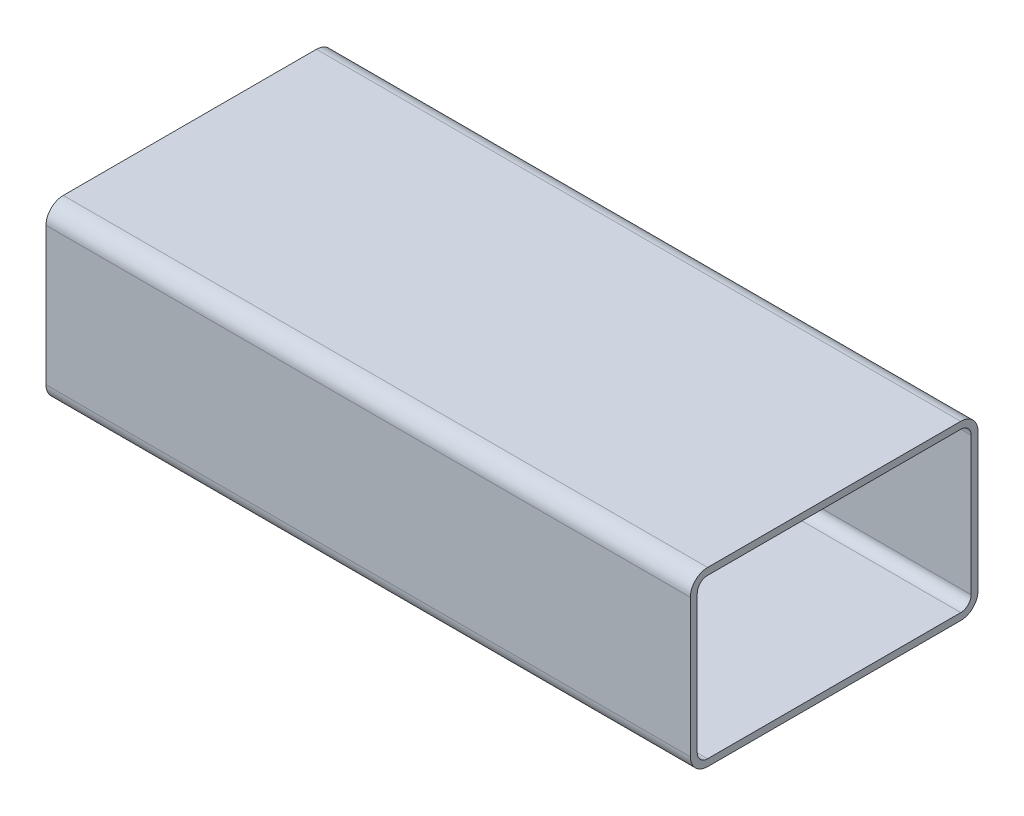
ISO-10303-21;
HEADER;
FILE_DESCRIPTION(('STEP AP214'),'2;1');
FILE_NAME('part.step','',(''),(''),'','','');
FILE_SCHEMA(('AUTOMOTIVE_DESIGN { 1 0 10303 214 1 1 1 1 }'));
ENDSEC;
DATA;
#1=APPLICATION_CONTEXT('core data for automotive mechanical design processes');
#2=APPLICATION_PROTOCOL_DEFINITION('international standard','automotive_design',2000,#1);
#3=PRODUCT_CONTEXT('',#1,'mechanical');
#4=PRODUCT('Part','Part','',(#3));
#5=PRODUCT_RELATED_PRODUCT_CATEGORY('part','',(#4));
#6=PRODUCT_DEFINITION_FORMATION('','',#4);
#7=PRODUCT_DEFINITION_CONTEXT('part definition',#1,'design');
#8=PRODUCT_DEFINITION('design','',#6,#7);
#9=PRODUCT_DEFINITION_SHAPE('','',#8);
#10=(LENGTH_UNIT() NAMED_UNIT(*) SI_UNIT(.MILLI.,.METRE.));
#11=(NAMED_UNIT(*) PLANE_ANGLE_UNIT() SI_UNIT($,.RADIAN.));
#12=(NAMED_UNIT(*) SI_UNIT($,.STERADIAN.) SOLID_ANGLE_UNIT());
#13=UNCERTAINTY_MEASURE_WITH_UNIT(LENGTH_MEASURE(1.E-05),#10,'distance_accuracy_value','');
#14=(GEOMETRIC_REPRESENTATION_CONTEXT(3) GLOBAL_UNCERTAINTY_ASSIGNED_CONTEXT((#13)) GLOBAL_UNIT_ASSIGNED_CONTEXT((#10,
#11,#12)) REPRESENTATION_CONTEXT('',''));
#15=CARTESIAN_POINT('',(0.,0.,0.));
#16=DIRECTION('',(0.,0.,1.));
#17=DIRECTION('',(1.,0.,0.));
#18=AXIS2_PLACEMENT_3D('',#15,#16,#17);
#19=CARTESIAN_POINT('',(112.,12.,22.));
#20=DIRECTION('',(-1.,0.,0.));
#21=DIRECTION('',(0.,0.,1.));
#22=AXIS2_PLACEMENT_3D('',#19,#20,#21);
#23=CYLINDRICAL_SURFACE('',#22,3.);
#24=CARTESIAN_POINT('',(0.,12.,22.));
#25=DIRECTION('',(1.,0.,0.));
#26=DIRECTION('',(0.,0.,-1.));
#27=AXIS2_PLACEMENT_3D('',#24,#25,#26);
#28=CIRCLE('',#27,3.);
#29=CARTESIAN_POINT('',(0.,15.,22.));
#30=VERTEX_POINT('',#29);
#31=CARTESIAN_POINT('',(0.,12.,25.));
#32=VERTEX_POINT('',#31);
#33=EDGE_CURVE('E256',#30,#32,#28,.T.);
#34=ORIENTED_EDGE('',*,*,#33,.T.);
#35=DIRECTION('',(-1.,0.,0.));
#36=VECTOR('',#35,1.);
#37=CARTESIAN_POINT('',(112.,12.,25.));
#38=LINE('',#37,#36);
#39=CARTESIAN_POINT('',(112.,12.,25.));
#40=VERTEX_POINT('',#39);
#41=EDGE_CURVE('E12',#40,#32,#38,.T.);
#42=ORIENTED_EDGE('',*,*,#41,.F.);
#43=CARTESIAN_POINT('',(112.,12.,22.));
#44=DIRECTION('',(1.,0.,0.));
#45=DIRECTION('',(0.,0.,-1.));
#46=AXIS2_PLACEMENT_3D('',#43,#44,#45);
#47=CIRCLE('',#46,3.);
#48=CARTESIAN_POINT('',(112.,15.,22.));
#49=VERTEX_POINT('',#48);
#50=EDGE_CURVE('E365',#49,#40,#47,.T.);
#51=ORIENTED_EDGE('',*,*,#50,.F.);
#52=DIRECTION('',(-1.,0.,0.));
#53=VECTOR('',#52,1.);
#54=CARTESIAN_POINT('',(112.,15.,22.));
#55=LINE('',#54,#53);
#56=EDGE_CURVE('E279',#49,#30,#55,.T.);
#57=ORIENTED_EDGE('',*,*,#56,.T.);
#58=EDGE_LOOP('',(#34,#42,#51,#57));
#59=FACE_BOUND('',#58,.T.);
#60=ADVANCED_FACE('F70',(#59),#23,.T.);
#61=CARTESIAN_POINT('',(112.,12.,25.));
#62=DIRECTION('',(0.,0.,-1.));
#63=DIRECTION('',(-1.,0.,0.));
#64=AXIS2_PLACEMENT_3D('',#61,#62,#63);
#65=PLANE('',#64);
#66=DIRECTION('',(0.,-1.,0.));
#67=VECTOR('',#66,1.);
#68=CARTESIAN_POINT('',(0.,12.,25.));
#69=LINE('',#68,#67);
#70=CARTESIAN_POINT('',(0.,-12.,25.));
#71=VERTEX_POINT('',#70);
#72=EDGE_CURVE('E260',#32,#71,#69,.T.);
#73=ORIENTED_EDGE('',*,*,#72,.T.);
#74=DIRECTION('',(-1.,0.,0.));
#75=VECTOR('',#74,1.);
#76=CARTESIAN_POINT('',(112.,-12.,25.));
#77=LINE('',#76,#75);
#78=CARTESIAN_POINT('',(112.,-12.,25.));
#79=VERTEX_POINT('',#78);
#80=EDGE_CURVE('E81',#79,#71,#77,.T.);
#81=ORIENTED_EDGE('',*,*,#80,.F.);
#82=DIRECTION('',(0.,-1.,0.));
#83=VECTOR('',#82,1.);
#84=CARTESIAN_POINT('',(112.,12.,25.));
#85=LINE('',#84,#83);
#86=EDGE_CURVE('E368',#40,#79,#85,.T.);
#87=ORIENTED_EDGE('',*,*,#86,.F.);
#88=ORIENTED_EDGE('',*,*,#41,.T.);
#89=EDGE_LOOP('',(#73,#81,#87,#88));
#90=FACE_BOUND('',#89,.T.);
#91=ADVANCED_FACE('F461',(#90),#65,.F.);
#92=CARTESIAN_POINT('',(112.,-12.,22.));
#93=DIRECTION('',(-1.,0.,0.));
#94=DIRECTION('',(0.,0.,1.));
#95=AXIS2_PLACEMENT_3D('',#92,#93,#94);
#96=CYLINDRICAL_SURFACE('',#95,3.);
#97=CARTESIAN_POINT('',(0.,-12.,22.));
#98=DIRECTION('',(1.,0.,0.));
#99=DIRECTION('',(0.,0.,-1.));
#100=AXIS2_PLACEMENT_3D('',#97,#98,#99);
#101=CIRCLE('',#100,3.);
#102=CARTESIAN_POINT('',(0.,-15.,22.));
#103=VERTEX_POINT('',#102);
#104=EDGE_CURVE('E263',#71,#103,#101,.T.);
#105=ORIENTED_EDGE('',*,*,#104,.T.);
#106=DIRECTION('',(-1.,0.,0.));
#107=VECTOR('',#106,1.);
#108=CARTESIAN_POINT('',(112.,-15.,22.));
#109=LINE('',#108,#107);
#110=CARTESIAN_POINT('',(112.,-15.,22.));
#111=VERTEX_POINT('',#110);
#112=EDGE_CURVE('E290',#111,#103,#109,.T.);
#113=ORIENTED_EDGE('',*,*,#112,.F.);
#114=CARTESIAN_POINT('',(112.,-12.,22.));
#115=DIRECTION('',(1.,0.,0.));
#116=DIRECTION('',(0.,0.,-1.));
#117=AXIS2_PLACEMENT_3D('',#114,#115,#116);
#118=CIRCLE('',#117,3.);
#119=EDGE_CURVE('E371',#79,#111,#118,.T.);
#120=ORIENTED_EDGE('',*,*,#119,.F.);
#121=ORIENTED_EDGE('',*,*,#80,.T.);
#122=EDGE_LOOP('',(#105,#113,#120,#121));
#123=FACE_BOUND('',#122,.T.);
#124=ADVANCED_FACE('F467',(#123),#96,.T.);
#125=CARTESIAN_POINT('',(112.,-15.,-22.));
#126=DIRECTION('',(0.,1.,0.));
#127=DIRECTION('',(0.,0.,1.));
#128=AXIS2_PLACEMENT_3D('',#125,#126,#127);
#129=PLANE('',#128);
#130=DIRECTION('',(0.,0.,-1.));
#131=VECTOR('',#130,1.);
#132=CARTESIAN_POINT('',(0.,-15.,-22.));
#133=LINE('',#132,#131);
#134=CARTESIAN_POINT('',(0.,-15.,-22.));
#135=VERTEX_POINT('',#134);
#136=EDGE_CURVE('E266',#103,#135,#133,.T.);
#137=ORIENTED_EDGE('',*,*,#136,.T.);
#138=DIRECTION('',(-1.,0.,0.));
#139=VECTOR('',#138,1.);
#140=CARTESIAN_POINT('',(112.,-15.,-22.));
#141=LINE('',#140,#139);
#142=CARTESIAN_POINT('',(112.,-15.,-22.));
#143=VERTEX_POINT('',#142);
#144=EDGE_CURVE('E286',#143,#135,#141,.T.);
#145=ORIENTED_EDGE('',*,*,#144,.F.);
#146=DIRECTION('',(0.,0.,-1.));
#147=VECTOR('',#146,1.);
#148=CARTESIAN_POINT('',(112.,-15.,-22.));
#149=LINE('',#148,#147);
#150=EDGE_CURVE('E374',#111,#143,#149,.T.);
#151=ORIENTED_EDGE('',*,*,#150,.F.);
#152=ORIENTED_EDGE('',*,*,#112,.T.);
#153=EDGE_LOOP('',(#137,#145,#151,#152));
#154=FACE_BOUND('',#153,.T.);
#155=ADVANCED_FACE('F607',(#154),#129,.F.);
#156=CARTESIAN_POINT('',(112.,-12.,-22.));
#157=DIRECTION('',(-1.,0.,0.));
#158=DIRECTION('',(0.,0.,1.));
#159=AXIS2_PLACEMENT_3D('',#156,#157,#158);
#160=CYLINDRICAL_SURFACE('',#159,3.);
#161=CARTESIAN_POINT('',(0.,-12.,-22.));
#162=DIRECTION('',(1.,0.,0.));
#163=DIRECTION('',(0.,0.,-1.));
#164=AXIS2_PLACEMENT_3D('',#161,#162,#163);
#165=CIRCLE('',#164,3.);
#166=CARTESIAN_POINT('',(0.,-12.,-25.));
#167=VERTEX_POINT('',#166);
#168=EDGE_CURVE('E269',#135,#167,#165,.T.);
#169=ORIENTED_EDGE('',*,*,#168,.T.);
#170=DIRECTION('',(-1.,0.,0.));
#171=VECTOR('',#170,1.);
#172=CARTESIAN_POINT('',(112.,-12.,-25.));
#173=LINE('',#172,#171);
#174=CARTESIAN_POINT('',(112.,-12.,-25.));
#175=VERTEX_POINT('',#174);
#176=EDGE_CURVE('E212',#175,#167,#173,.T.);
#177=ORIENTED_EDGE('',*,*,#176,.F.);
#178=CARTESIAN_POINT('',(112.,-12.,-22.));
#179=DIRECTION('',(1.,0.,0.));
#180=DIRECTION('',(0.,0.,-1.));
#181=AXIS2_PLACEMENT_3D('',#178,#179,#180);
#182=CIRCLE('',#181,3.);
#183=EDGE_CURVE('E201',#143,#175,#182,.T.);
#184=ORIENTED_EDGE('',*,*,#183,.F.);
#185=ORIENTED_EDGE('',*,*,#144,.T.);
#186=EDGE_LOOP('',(#169,#177,#184,#185));
#187=FACE_BOUND('',#186,.T.);
#188=ADVANCED_FACE('F596',(#187),#160,.T.);
#189=CARTESIAN_POINT('',(112.,-12.,-25.));
#190=DIRECTION('',(0.,0.,1.));
#191=DIRECTION('',(1.,0.,0.));
#192=AXIS2_PLACEMENT_3D('',#189,#190,#191);
#193=PLANE('',#192);
#194=DIRECTION('',(0.,1.,0.));
#195=VECTOR('',#194,1.);
#196=CARTESIAN_POINT('',(0.,-12.,-25.));
#197=LINE('',#196,#195);
#198=CARTESIAN_POINT('',(0.,12.,-25.));
#199=VERTEX_POINT('',#198);
#200=EDGE_CURVE('E210',#167,#199,#197,.T.);
#201=ORIENTED_EDGE('',*,*,#200,.T.);
#202=DIRECTION('',(-1.,0.,0.));
#203=VECTOR('',#202,1.);
#204=CARTESIAN_POINT('',(112.,12.,-25.));
#205=LINE('',#204,#203);
#206=CARTESIAN_POINT('',(112.,12.,-25.));
#207=VERTEX_POINT('',#206);
#208=EDGE_CURVE('E207',#207,#199,#205,.T.);
#209=ORIENTED_EDGE('',*,*,#208,.F.);
#210=DIRECTION('',(0.,1.,0.));
#211=VECTOR('',#210,1.);
#212=CARTESIAN_POINT('',(112.,-12.,-25.));
#213=LINE('',#212,#211);
#214=EDGE_CURVE('E195',#175,#207,#213,.T.);
#215=ORIENTED_EDGE('',*,*,#214,.F.);
#216=ORIENTED_EDGE('',*,*,#176,.T.);
#217=EDGE_LOOP('',(#201,#209,#215,#216));
#218=FACE_BOUND('',#217,.T.);
#219=ADVANCED_FACE('F208',(#218),#193,.F.);
#220=CARTESIAN_POINT('',(112.,12.,-22.));
#221=DIRECTION('',(-1.,0.,0.));
#222=DIRECTION('',(0.,0.,1.));
#223=AXIS2_PLACEMENT_3D('',#220,#221,#222);
#224=CYLINDRICAL_SURFACE('',#223,3.);
#225=CARTESIAN_POINT('',(0.,12.,-22.));
#226=DIRECTION('',(1.,0.,0.));
#227=DIRECTION('',(0.,0.,-1.));
#228=AXIS2_PLACEMENT_3D('',#225,#226,#227);
#229=CIRCLE('',#228,3.);
#230=CARTESIAN_POINT('',(0.,15.,-22.));
#231=VERTEX_POINT('',#230);
#232=EDGE_CURVE('E143',#199,#231,#229,.T.);
#233=ORIENTED_EDGE('',*,*,#232,.T.);
#234=DIRECTION('',(-1.,0.,0.));
#235=VECTOR('',#234,1.);
#236=CARTESIAN_POINT('',(112.,15.,-22.));
#237=LINE('',#236,#235);
#238=CARTESIAN_POINT('',(112.,15.,-22.));
#239=VERTEX_POINT('',#238);
#240=EDGE_CURVE('E213',#239,#231,#237,.T.);
#241=ORIENTED_EDGE('',*,*,#240,.F.);
#242=CARTESIAN_POINT('',(112.,12.,-22.));
#243=DIRECTION('',(1.,0.,0.));
#244=DIRECTION('',(0.,0.,-1.));
#245=AXIS2_PLACEMENT_3D('',#242,#243,#244);
#246=CIRCLE('',#245,3.);
#247=EDGE_CURVE('E199',#207,#239,#246,.T.);
#248=ORIENTED_EDGE('',*,*,#247,.F.);
#249=ORIENTED_EDGE('',*,*,#208,.T.);
#250=EDGE_LOOP('',(#233,#241,#248,#249));
#251=FACE_BOUND('',#250,.T.);
#252=ADVANCED_FACE('F215',(#251),#224,.T.);
#253=CARTESIAN_POINT('',(112.,-12.,22.));
#254=DIRECTION('',(-1.,0.,0.));
#255=DIRECTION('',(0.,0.,1.));
#256=AXIS2_PLACEMENT_3D('',#253,#254,#255);
#257=CYLINDRICAL_SURFACE('',#256,1.8);
#258=CARTESIAN_POINT('',(0.,-12.,22.));
#259=DIRECTION('',(1.,0.,0.));
#260=DIRECTION('',(0.,0.,-1.));
#261=AXIS2_PLACEMENT_3D('',#258,#259,#260);
#262=CIRCLE('',#261,1.8);
#263=CARTESIAN_POINT('',(0.,-12.,23.8));
#264=VERTEX_POINT('',#263);
#265=CARTESIAN_POINT('',(0.,-13.8,22.));
#266=VERTEX_POINT('',#265);
#267=EDGE_CURVE('E224',#264,#266,#262,.T.);
#268=ORIENTED_EDGE('',*,*,#267,.F.);
#269=DIRECTION('',(-1.,0.,0.));
#270=VECTOR('',#269,1.);
#271=CARTESIAN_POINT('',(112.,-12.,23.8));
#272=LINE('',#271,#270);
#273=CARTESIAN_POINT('',(112.,-12.,23.8));
#274=VERTEX_POINT('',#273);
#275=EDGE_CURVE('E74',#274,#264,#272,.T.);
#276=ORIENTED_EDGE('',*,*,#275,.F.);
#277=CARTESIAN_POINT('',(112.,-12.,22.));
#278=DIRECTION('',(1.,0.,0.));
#279=DIRECTION('',(0.,0.,-1.));
#280=AXIS2_PLACEMENT_3D('',#277,#278,#279);
#281=CIRCLE('',#280,1.8);
#282=CARTESIAN_POINT('',(112.,-13.8,22.));
#283=VERTEX_POINT('',#282);
#284=EDGE_CURVE('E278',#274,#283,#281,.T.);
#285=ORIENTED_EDGE('',*,*,#284,.T.);
#286=DIRECTION('',(-1.,0.,0.));
#287=VECTOR('',#286,1.);
#288=CARTESIAN_POINT('',(112.,-13.8,22.));
#289=LINE('',#288,#287);
#290=EDGE_CURVE('E220',#283,#266,#289,.T.);
#291=ORIENTED_EDGE('',*,*,#290,.T.);
#292=EDGE_LOOP('',(#268,#276,#285,#291));
#293=FACE_BOUND('',#292,.T.);
#294=ADVANCED_FACE('F72',(#293),#257,.F.);
#295=CARTESIAN_POINT('',(112.,12.,23.8));
#296=DIRECTION('',(0.,0.,-1.));
#297=DIRECTION('',(-1.,0.,0.));
#298=AXIS2_PLACEMENT_3D('',#295,#296,#297);
#299=PLANE('',#298);
#300=DIRECTION('',(0.,-1.,0.));
#301=VECTOR('',#300,1.);
#302=CARTESIAN_POINT('',(0.,12.,23.8));
#303=LINE('',#302,#301);
#304=CARTESIAN_POINT('',(0.,12.,23.8));
#305=VERTEX_POINT('',#304);
#306=EDGE_CURVE('E228',#305,#264,#303,.T.);
#307=ORIENTED_EDGE('',*,*,#306,.F.);
#308=DIRECTION('',(-1.,0.,0.));
#309=VECTOR('',#308,1.);
#310=CARTESIAN_POINT('',(112.,12.,23.8));
#311=LINE('',#310,#309);
#312=CARTESIAN_POINT('',(112.,12.,23.8));
#313=VERTEX_POINT('',#312);
#314=EDGE_CURVE('E313',#313,#305,#311,.T.);
#315=ORIENTED_EDGE('',*,*,#314,.F.);
#316=DIRECTION('',(0.,-1.,0.));
#317=VECTOR('',#316,1.);
#318=CARTESIAN_POINT('',(112.,12.,23.8));
#319=LINE('',#318,#317);
#320=EDGE_CURVE('E326',#313,#274,#319,.T.);
#321=ORIENTED_EDGE('',*,*,#320,.T.);
#322=ORIENTED_EDGE('',*,*,#275,.T.);
#323=EDGE_LOOP('',(#307,#315,#321,#322));
#324=FACE_BOUND('',#323,.T.);
#325=ADVANCED_FACE('F324',(#324),#299,.T.);
#326=CARTESIAN_POINT('',(112.,12.,22.));
#327=DIRECTION('',(-1.,0.,0.));
#328=DIRECTION('',(0.,0.,1.));
#329=AXIS2_PLACEMENT_3D('',#326,#327,#328);
#330=CYLINDRICAL_SURFACE('',#329,1.8);
#331=CARTESIAN_POINT('',(0.,12.,22.));
#332=DIRECTION('',(1.,0.,0.));
#333=DIRECTION('',(0.,0.,-1.));
#334=AXIS2_PLACEMENT_3D('',#331,#332,#333);
#335=CIRCLE('',#334,1.8);
#336=CARTESIAN_POINT('',(0.,13.8,22.));
#337=VERTEX_POINT('',#336);
#338=EDGE_CURVE('E232',#337,#305,#335,.T.);
#339=ORIENTED_EDGE('',*,*,#338,.F.);
#340=DIRECTION('',(-1.,0.,0.));
#341=VECTOR('',#340,1.);
#342=CARTESIAN_POINT('',(112.,13.8,22.));
#343=LINE('',#342,#341);
#344=CARTESIAN_POINT('',(112.,13.8,22.));
#345=VERTEX_POINT('',#344);
#346=EDGE_CURVE('E311',#345,#337,#343,.T.);
#347=ORIENTED_EDGE('',*,*,#346,.F.);
#348=CARTESIAN_POINT('',(112.,12.,22.));
#349=DIRECTION('',(1.,0.,0.));
#350=DIRECTION('',(0.,0.,-1.));
#351=AXIS2_PLACEMENT_3D('',#348,#349,#350);
#352=CIRCLE('',#351,1.8);
#353=EDGE_CURVE('E334',#345,#313,#352,.T.);
#354=ORIENTED_EDGE('',*,*,#353,.T.);
#355=ORIENTED_EDGE('',*,*,#314,.T.);
#356=EDGE_LOOP('',(#339,#347,#354,#355));
#357=FACE_BOUND('',#356,.T.);
#358=ADVANCED_FACE('F332',(#357),#330,.F.);
#359=CARTESIAN_POINT('',(112.,13.8,22.));
#360=DIRECTION('',(0.,-1.,0.));
#361=DIRECTION('',(0.,0.,-1.));
#362=AXIS2_PLACEMENT_3D('',#359,#360,#361);
#363=PLANE('',#362);
#364=DIRECTION('',(0.,0.,1.));
#365=VECTOR('',#364,1.);
#366=CARTESIAN_POINT('',(0.,13.8,22.));
#367=LINE('',#366,#365);
#368=CARTESIAN_POINT('',(0.,13.8,-22.));
#369=VERTEX_POINT('',#368);
#370=EDGE_CURVE('E236',#369,#337,#367,.T.);
#371=ORIENTED_EDGE('',*,*,#370,.F.);
#372=DIRECTION('',(-1.,0.,0.));
#373=VECTOR('',#372,1.);
#374=CARTESIAN_POINT('',(112.,13.8,-22.));
#375=LINE('',#374,#373);
#376=CARTESIAN_POINT('',(112.,13.8,-22.));
#377=VERTEX_POINT('',#376);
#378=EDGE_CURVE('E308',#377,#369,#375,.T.);
#379=ORIENTED_EDGE('',*,*,#378,.F.);
#380=DIRECTION('',(0.,0.,1.));
#381=VECTOR('',#380,1.);
#382=CARTESIAN_POINT('',(112.,13.8,22.));
#383=LINE('',#382,#381);
#384=EDGE_CURVE('E340',#377,#345,#383,.T.);
#385=ORIENTED_EDGE('',*,*,#384,.T.);
#386=ORIENTED_EDGE('',*,*,#346,.T.);
#387=EDGE_LOOP('',(#371,#379,#385,#386));
#388=FACE_BOUND('',#387,.T.);
#389=ADVANCED_FACE('F344',(#388),#363,.T.);
#390=CARTESIAN_POINT('',(112.,12.,-22.));
#391=DIRECTION('',(-1.,0.,0.));
#392=DIRECTION('',(0.,0.,1.));
#393=AXIS2_PLACEMENT_3D('',#390,#391,#392);
#394=CYLINDRICAL_SURFACE('',#393,1.8);
#395=CARTESIAN_POINT('',(0.,12.,-22.));
#396=DIRECTION('',(1.,0.,0.));
#397=DIRECTION('',(0.,0.,-1.));
#398=AXIS2_PLACEMENT_3D('',#395,#396,#397);
#399=CIRCLE('',#398,1.8);
#400=CARTESIAN_POINT('',(0.,12.,-23.8));
#401=VERTEX_POINT('',#400);
#402=EDGE_CURVE('E240',#401,#369,#399,.T.);
#403=ORIENTED_EDGE('',*,*,#402,.F.);
#404=DIRECTION('',(-1.,0.,0.));
#405=VECTOR('',#404,1.);
#406=CARTESIAN_POINT('',(112.,12.,-23.8));
#407=LINE('',#406,#405);
#408=CARTESIAN_POINT('',(112.,12.,-23.8));
#409=VERTEX_POINT('',#408);
#410=EDGE_CURVE('E305',#409,#401,#407,.T.);
#411=ORIENTED_EDGE('',*,*,#410,.F.);
#412=CARTESIAN_POINT('',(112.,12.,-22.));
#413=DIRECTION('',(1.,0.,0.));
#414=DIRECTION('',(0.,0.,-1.));
#415=AXIS2_PLACEMENT_3D('',#412,#413,#414);
#416=CIRCLE('',#415,1.8);
#417=EDGE_CURVE('E346',#409,#377,#416,.T.);
#418=ORIENTED_EDGE('',*,*,#417,.T.);
#419=ORIENTED_EDGE('',*,*,#378,.T.);
#420=EDGE_LOOP('',(#403,#411,#418,#419));
#421=FACE_BOUND('',#420,.T.);
#422=ADVANCED_FACE('F451',(#421),#394,.F.);
#423=CARTESIAN_POINT('',(112.,-12.,-23.8));
#424=DIRECTION('',(0.,0.,1.));
#425=DIRECTION('',(1.,0.,0.));
#426=AXIS2_PLACEMENT_3D('',#423,#424,#425);
#427=PLANE('',#426);
#428=DIRECTION('',(0.,1.,0.));
#429=VECTOR('',#428,1.);
#430=CARTESIAN_POINT('',(0.,-12.,-23.8));
#431=LINE('',#430,#429);
#432=CARTESIAN_POINT('',(0.,-12.,-23.8));
#433=VERTEX_POINT('',#432);
#434=EDGE_CURVE('E244',#433,#401,#431,.T.);
#435=ORIENTED_EDGE('',*,*,#434,.F.);
#436=DIRECTION('',(-1.,0.,0.));
#437=VECTOR('',#436,1.);
#438=CARTESIAN_POINT('',(112.,-12.,-23.8));
#439=LINE('',#438,#437);
#440=CARTESIAN_POINT('',(112.,-12.,-23.8));
#441=VERTEX_POINT('',#440);
#442=EDGE_CURVE('E302',#441,#433,#439,.T.);
#443=ORIENTED_EDGE('',*,*,#442,.F.);
#444=DIRECTION('',(0.,1.,0.));
#445=VECTOR('',#444,1.);
#446=CARTESIAN_POINT('',(112.,-12.,-23.8));
#447=LINE('',#446,#445);
#448=EDGE_CURVE('E350',#441,#409,#447,.T.);
#449=ORIENTED_EDGE('',*,*,#448,.T.);
#450=ORIENTED_EDGE('',*,*,#410,.T.);
#451=EDGE_LOOP('',(#435,#443,#449,#450));
#452=FACE_BOUND('',#451,.T.);
#453=ADVANCED_FACE('F448',(#452),#427,.T.);
#454=CARTESIAN_POINT('',(112.,-12.,-22.));
#455=DIRECTION('',(-1.,0.,0.));
#456=DIRECTION('',(0.,0.,1.));
#457=AXIS2_PLACEMENT_3D('',#454,#455,#456);
#458=CYLINDRICAL_SURFACE('',#457,1.8);
#459=CARTESIAN_POINT('',(0.,-12.,-22.));
#460=DIRECTION('',(1.,0.,0.));
#461=DIRECTION('',(0.,0.,-1.));
#462=AXIS2_PLACEMENT_3D('',#459,#460,#461);
#463=CIRCLE('',#462,1.8);
#464=CARTESIAN_POINT('',(0.,-13.8,-22.));
#465=VERTEX_POINT('',#464);
#466=EDGE_CURVE('E248',#465,#433,#463,.T.);
#467=ORIENTED_EDGE('',*,*,#466,.F.);
#468=DIRECTION('',(-1.,0.,0.));
#469=VECTOR('',#468,1.);
#470=CARTESIAN_POINT('',(112.,-13.8,-22.));
#471=LINE('',#470,#469);
#472=CARTESIAN_POINT('',(112.,-13.8,-22.));
#473=VERTEX_POINT('',#472);
#474=EDGE_CURVE('E299',#473,#465,#471,.T.);
#475=ORIENTED_EDGE('',*,*,#474,.F.);
#476=CARTESIAN_POINT('',(112.,-12.,-22.));
#477=DIRECTION('',(1.,0.,0.));
#478=DIRECTION('',(0.,0.,-1.));
#479=AXIS2_PLACEMENT_3D('',#476,#477,#478);
#480=CIRCLE('',#479,1.8);
#481=EDGE_CURVE('E357',#473,#441,#480,.T.);
#482=ORIENTED_EDGE('',*,*,#481,.T.);
#483=ORIENTED_EDGE('',*,*,#442,.T.);
#484=EDGE_LOOP('',(#467,#475,#482,#483));
#485=FACE_BOUND('',#484,.T.);
#486=ADVANCED_FACE('F446',(#485),#458,.F.);
#487=CARTESIAN_POINT('',(112.,-13.8,-22.));
#488=DIRECTION('',(0.,1.,0.));
#489=DIRECTION('',(0.,0.,1.));
#490=AXIS2_PLACEMENT_3D('',#487,#488,#489);
#491=PLANE('',#490);
#492=DIRECTION('',(0.,0.,-1.));
#493=VECTOR('',#492,1.);
#494=CARTESIAN_POINT('',(0.,-13.8,-22.));
#495=LINE('',#494,#493);
#496=EDGE_CURVE('E252',#266,#465,#495,.T.);
#497=ORIENTED_EDGE('',*,*,#496,.F.);
#498=ORIENTED_EDGE('',*,*,#290,.F.);
#499=DIRECTION('',(0.,0.,-1.));
#500=VECTOR('',#499,1.);
#501=CARTESIAN_POINT('',(112.,-13.8,-22.));
#502=LINE('',#501,#500);
#503=EDGE_CURVE('E361',#283,#473,#502,.T.);
#504=ORIENTED_EDGE('',*,*,#503,.T.);
#505=ORIENTED_EDGE('',*,*,#474,.T.);
#506=EDGE_LOOP('',(#497,#498,#504,#505));
#507=FACE_BOUND('',#506,.T.);
#508=ADVANCED_FACE('F442',(#507),#491,.T.);
#509=CARTESIAN_POINT('',(112.,15.,22.));
#510=DIRECTION('',(0.,-1.,0.));
#511=DIRECTION('',(0.,0.,-1.));
#512=AXIS2_PLACEMENT_3D('',#509,#510,#511);
#513=PLANE('',#512);
#514=DIRECTION('',(0.,0.,1.));
#515=VECTOR('',#514,1.);
#516=CARTESIAN_POINT('',(0.,15.,22.));
#517=LINE('',#516,#515);
#518=EDGE_CURVE('E149',#231,#30,#517,.T.);
#519=ORIENTED_EDGE('',*,*,#518,.T.);
#520=ORIENTED_EDGE('',*,*,#56,.F.);
#521=DIRECTION('',(0.,0.,1.));
#522=VECTOR('',#521,1.);
#523=CARTESIAN_POINT('',(112.,15.,22.));
#524=LINE('',#523,#522);
#525=EDGE_CURVE('E90',#239,#49,#524,.T.);
#526=ORIENTED_EDGE('',*,*,#525,.F.);
#527=ORIENTED_EDGE('',*,*,#240,.T.);
#528=EDGE_LOOP('',(#519,#520,#526,#527));
#529=FACE_BOUND('',#528,.T.);
#530=ADVANCED_FACE('F474',(#529),#513,.F.);
#531=CARTESIAN_POINT('',(112.,12.,22.));
#532=DIRECTION('',(1.,0.,0.));
#533=DIRECTION('',(0.,0.,-1.));
#534=AXIS2_PLACEMENT_3D('',#531,#532,#533);
#535=PLANE('',#534);
#536=ORIENTED_EDGE('',*,*,#284,.F.);
#537=ORIENTED_EDGE('',*,*,#320,.F.);
#538=ORIENTED_EDGE('',*,*,#353,.F.);
#539=ORIENTED_EDGE('',*,*,#384,.F.);
#540=ORIENTED_EDGE('',*,*,#417,.F.);
#541=ORIENTED_EDGE('',*,*,#448,.F.);
#542=ORIENTED_EDGE('',*,*,#481,.F.);
#543=ORIENTED_EDGE('',*,*,#503,.F.);
#544=EDGE_LOOP('',(#536,#537,#538,#539,#540,#541,#542,#543));
#545=FACE_BOUND('',#544,.T.);
#546=ORIENTED_EDGE('',*,*,#50,.T.);
#547=ORIENTED_EDGE('',*,*,#86,.T.);
#548=ORIENTED_EDGE('',*,*,#119,.T.);
#549=ORIENTED_EDGE('',*,*,#150,.T.);
#550=ORIENTED_EDGE('',*,*,#183,.T.);
#551=ORIENTED_EDGE('',*,*,#214,.T.);
#552=ORIENTED_EDGE('',*,*,#247,.T.);
#553=ORIENTED_EDGE('',*,*,#525,.T.);
#554=EDGE_LOOP('',(#546,#547,#548,#549,#550,#551,#552,#553));
#555=FACE_BOUND('',#554,.T.);
#556=ADVANCED_FACE('F197',(#545,#555),#535,.T.);
#557=CARTESIAN_POINT('',(0.,12.,22.));
#558=DIRECTION('',(1.,0.,0.));
#559=DIRECTION('',(0.,0.,-1.));
#560=AXIS2_PLACEMENT_3D('',#557,#558,#559);
#561=PLANE('',#560);
#562=ORIENTED_EDGE('',*,*,#267,.T.);
#563=ORIENTED_EDGE('',*,*,#496,.T.);
#564=ORIENTED_EDGE('',*,*,#466,.T.);
#565=ORIENTED_EDGE('',*,*,#434,.T.);
#566=ORIENTED_EDGE('',*,*,#402,.T.);
#567=ORIENTED_EDGE('',*,*,#370,.T.);
#568=ORIENTED_EDGE('',*,*,#338,.T.);
#569=ORIENTED_EDGE('',*,*,#306,.T.);
#570=EDGE_LOOP('',(#562,#563,#564,#565,#566,#567,#568,#569));
#571=FACE_BOUND('',#570,.T.);
#572=ORIENTED_EDGE('',*,*,#33,.F.);
#573=ORIENTED_EDGE('',*,*,#518,.F.);
#574=ORIENTED_EDGE('',*,*,#232,.F.);
#575=ORIENTED_EDGE('',*,*,#200,.F.);
#576=ORIENTED_EDGE('',*,*,#168,.F.);
#577=ORIENTED_EDGE('',*,*,#136,.F.);
#578=ORIENTED_EDGE('',*,*,#104,.F.);
#579=ORIENTED_EDGE('',*,*,#72,.F.);
#580=EDGE_LOOP('',(#572,#573,#574,#575,#576,#577,#578,#579));
#581=FACE_BOUND('',#580,.T.);
#582=ADVANCED_FACE('F329',(#571,#581),#561,.F.);
#583=CLOSED_SHELL('',(#60,#91,#124,#155,#188,#219,#252,#294,#325,#358,#389,#422,#453,#486,#508,
#530,#556,#582));
#584=MANIFOLD_SOLID_BREP('B2',#583);
#585=ADVANCED_BREP_SHAPE_REPRESENTATION('',(#18,#584),#14);
#586=SHAPE_DEFINITION_REPRESENTATION(#9,#585);
ENDSEC;
END-ISO-10303-21;
